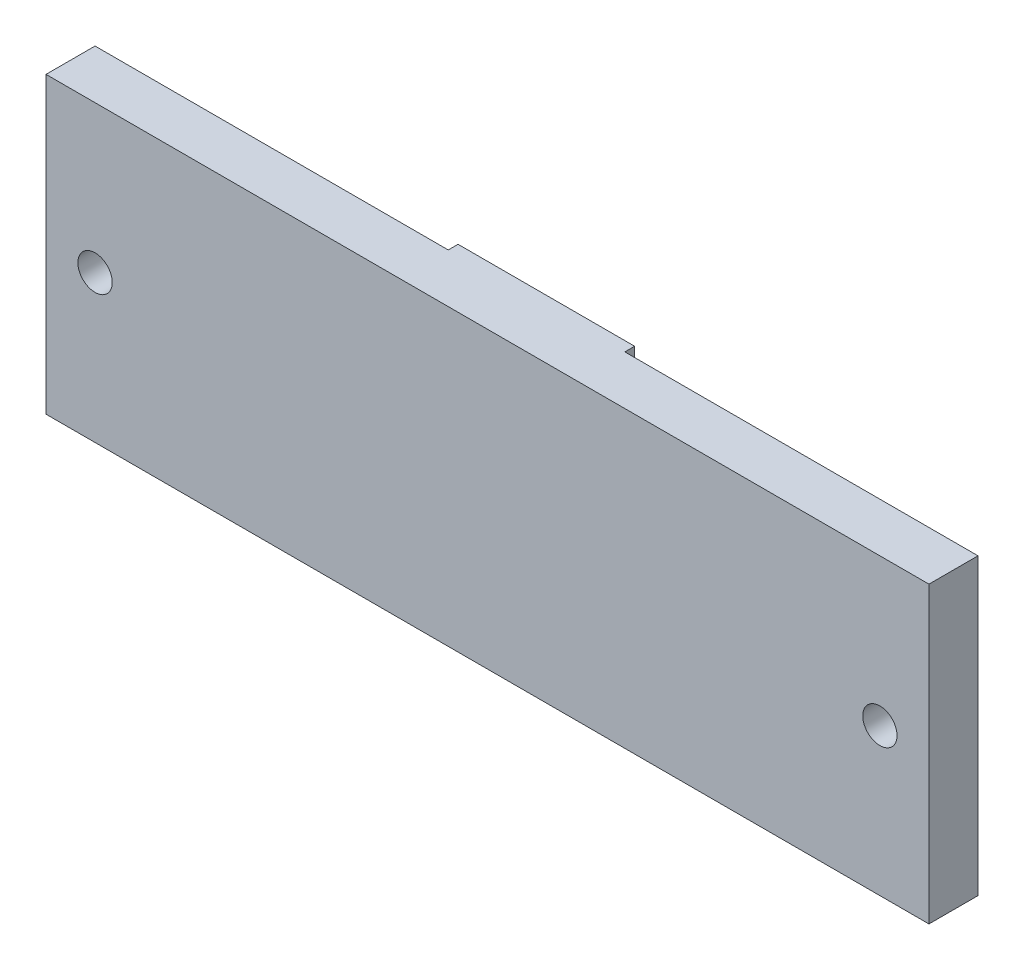
ISO-10303-21;
HEADER;
FILE_DESCRIPTION(('STEP AP214'),'2;1');
FILE_NAME('part.step','',(''),(''),'','','');
FILE_SCHEMA(('AUTOMOTIVE_DESIGN { 1 0 10303 214 1 1 1 1 }'));
ENDSEC;
DATA;
#1=APPLICATION_CONTEXT('core data for automotive mechanical design processes');
#2=APPLICATION_PROTOCOL_DEFINITION('international standard','automotive_design',2000,#1);
#3=PRODUCT_CONTEXT('',#1,'mechanical');
#4=PRODUCT('Part','Part','',(#3));
#5=PRODUCT_RELATED_PRODUCT_CATEGORY('part','',(#4));
#6=PRODUCT_DEFINITION_FORMATION('','',#4);
#7=PRODUCT_DEFINITION_CONTEXT('part definition',#1,'design');
#8=PRODUCT_DEFINITION('design','',#6,#7);
#9=PRODUCT_DEFINITION_SHAPE('','',#8);
#10=(LENGTH_UNIT() NAMED_UNIT(*) SI_UNIT(.MILLI.,.METRE.));
#11=(NAMED_UNIT(*) PLANE_ANGLE_UNIT() SI_UNIT($,.RADIAN.));
#12=(NAMED_UNIT(*) SI_UNIT($,.STERADIAN.) SOLID_ANGLE_UNIT());
#13=UNCERTAINTY_MEASURE_WITH_UNIT(LENGTH_MEASURE(1.E-05),#10,'distance_accuracy_value','');
#14=(GEOMETRIC_REPRESENTATION_CONTEXT(3) GLOBAL_UNCERTAINTY_ASSIGNED_CONTEXT((#13)) GLOBAL_UNIT_ASSIGNED_CONTEXT((#10,
#11,#12)) REPRESENTATION_CONTEXT('',''));
#15=CARTESIAN_POINT('',(0.,0.,0.));
#16=DIRECTION('',(0.,0.,1.));
#17=DIRECTION('',(1.,0.,0.));
#18=AXIS2_PLACEMENT_3D('',#15,#16,#17);
#19=CARTESIAN_POINT('',(0.,0.,0.));
#20=DIRECTION('',(0.,0.,-1.));
#21=DIRECTION('',(-1.,0.,0.));
#22=AXIS2_PLACEMENT_3D('',#19,#20,#21);
#23=PLANE('',#22);
#24=DIRECTION('',(0.,-1.,0.));
#25=VECTOR('',#24,1.);
#26=CARTESIAN_POINT('',(9.,0.,0.));
#27=LINE('',#26,#25);
#28=CARTESIAN_POINT('',(9.00000000000001,0.,0.));
#29=VERTEX_POINT('',#28);
#30=CARTESIAN_POINT('',(9.00000000000001,-30.,0.));
#31=VERTEX_POINT('',#30);
#32=EDGE_CURVE('E48',#29,#31,#27,.T.);
#33=ORIENTED_EDGE('',*,*,#32,.F.);
#34=DIRECTION('',(-1.,0.,0.));
#35=VECTOR('',#34,1.);
#36=CARTESIAN_POINT('',(45.,0.,0.));
#37=LINE('',#36,#35);
#38=CARTESIAN_POINT('',(45.,0.,0.));
#39=VERTEX_POINT('',#38);
#40=EDGE_CURVE('E151',#39,#29,#37,.T.);
#41=ORIENTED_EDGE('',*,*,#40,.F.);
#42=DIRECTION('',(0.,1.,0.));
#43=VECTOR('',#42,1.);
#44=CARTESIAN_POINT('',(45.,0.,0.));
#45=LINE('',#44,#43);
#46=CARTESIAN_POINT('',(45.,-30.,0.));
#47=VERTEX_POINT('',#46);
#48=EDGE_CURVE('E131',#47,#39,#45,.T.);
#49=ORIENTED_EDGE('',*,*,#48,.F.);
#50=DIRECTION('',(1.,0.,0.));
#51=VECTOR('',#50,1.);
#52=CARTESIAN_POINT('',(45.,-30.,0.));
#53=LINE('',#52,#51);
#54=EDGE_CURVE('E53',#31,#47,#53,.T.);
#55=ORIENTED_EDGE('',*,*,#54,.F.);
#56=EDGE_LOOP('',(#33,#41,#49,#55));
#57=FACE_BOUND('',#56,.T.);
#58=CARTESIAN_POINT('',(40.,-15.,0.));
#59=DIRECTION('',(0.,0.,1.));
#60=DIRECTION('',(1.,0.,0.));
#61=AXIS2_PLACEMENT_3D('',#58,#59,#60);
#62=CIRCLE('',#61,1.75);
#63=CARTESIAN_POINT('',(41.75,-15.,0.));
#64=VERTEX_POINT('',#63);
#65=EDGE_CURVE('E128',#64,#64,#62,.T.);
#66=ORIENTED_EDGE('',*,*,#65,.T.);
#67=EDGE_LOOP('',(#66));
#68=FACE_BOUND('',#67,.T.);
#69=ADVANCED_FACE('F33',(#57,#68),#23,.T.);
#70=CARTESIAN_POINT('',(45.,0.,5.));
#71=DIRECTION('',(-1.,0.,0.));
#72=DIRECTION('',(0.,0.,1.));
#73=AXIS2_PLACEMENT_3D('',#70,#71,#72);
#74=PLANE('',#73);
#75=ORIENTED_EDGE('',*,*,#48,.T.);
#76=DIRECTION('',(0.,0.,-1.));
#77=VECTOR('',#76,1.);
#78=CARTESIAN_POINT('',(45.,0.,5.));
#79=LINE('',#78,#77);
#80=CARTESIAN_POINT('',(45.,0.,5.));
#81=VERTEX_POINT('',#80);
#82=EDGE_CURVE('E11',#81,#39,#79,.T.);
#83=ORIENTED_EDGE('',*,*,#82,.F.);
#84=DIRECTION('',(0.,1.,0.));
#85=VECTOR('',#84,1.);
#86=CARTESIAN_POINT('',(45.,0.,5.));
#87=LINE('',#86,#85);
#88=CARTESIAN_POINT('',(45.,-30.,5.));
#89=VERTEX_POINT('',#88);
#90=EDGE_CURVE('E137',#89,#81,#87,.T.);
#91=ORIENTED_EDGE('',*,*,#90,.F.);
#92=DIRECTION('',(0.,0.,-1.));
#93=VECTOR('',#92,1.);
#94=CARTESIAN_POINT('',(45.,-30.,5.));
#95=LINE('',#94,#93);
#96=EDGE_CURVE('E147',#89,#47,#95,.T.);
#97=ORIENTED_EDGE('',*,*,#96,.T.);
#98=EDGE_LOOP('',(#75,#83,#91,#97));
#99=FACE_BOUND('',#98,.T.);
#100=ADVANCED_FACE('F35',(#99),#74,.F.);
#101=CARTESIAN_POINT('',(45.,0.,5.));
#102=DIRECTION('',(0.,-1.,0.));
#103=DIRECTION('',(0.,0.,-1.));
#104=AXIS2_PLACEMENT_3D('',#101,#102,#103);
#105=PLANE('',#104);
#106=ORIENTED_EDGE('',*,*,#40,.T.);
#107=DIRECTION('',(0.,0.,1.));
#108=VECTOR('',#107,1.);
#109=CARTESIAN_POINT('',(9.,0.,-1.));
#110=LINE('',#109,#108);
#111=CARTESIAN_POINT('',(9.,0.,-1.));
#112=VERTEX_POINT('',#111);
#113=EDGE_CURVE('E179',#112,#29,#110,.T.);
#114=ORIENTED_EDGE('',*,*,#113,.F.);
#115=DIRECTION('',(1.,0.,0.));
#116=VECTOR('',#115,1.);
#117=CARTESIAN_POINT('',(9.,0.,-1.));
#118=LINE('',#117,#116);
#119=CARTESIAN_POINT('',(-9.,0.,-1.));
#120=VERTEX_POINT('',#119);
#121=EDGE_CURVE('E112',#120,#112,#118,.T.);
#122=ORIENTED_EDGE('',*,*,#121,.F.);
#123=DIRECTION('',(0.,0.,1.));
#124=VECTOR('',#123,1.);
#125=CARTESIAN_POINT('',(-9.,0.,-1.));
#126=LINE('',#125,#124);
#127=CARTESIAN_POINT('',(-9.,0.,0.));
#128=VERTEX_POINT('',#127);
#129=EDGE_CURVE('E124',#120,#128,#126,.T.);
#130=ORIENTED_EDGE('',*,*,#129,.T.);
#131=CARTESIAN_POINT('',(-45.,0.,0.));
#132=VERTEX_POINT('',#131);
#133=EDGE_CURVE('E150',#128,#132,#37,.T.);
#134=ORIENTED_EDGE('',*,*,#133,.T.);
#135=DIRECTION('',(0.,0.,-1.));
#136=VECTOR('',#135,1.);
#137=CARTESIAN_POINT('',(-45.,0.,5.));
#138=LINE('',#137,#136);
#139=CARTESIAN_POINT('',(-45.,0.,5.));
#140=VERTEX_POINT('',#139);
#141=EDGE_CURVE('E41',#140,#132,#138,.T.);
#142=ORIENTED_EDGE('',*,*,#141,.F.);
#143=DIRECTION('',(-1.,0.,0.));
#144=VECTOR('',#143,1.);
#145=CARTESIAN_POINT('',(45.,0.,5.));
#146=LINE('',#145,#144);
#147=EDGE_CURVE('E140',#81,#140,#146,.T.);
#148=ORIENTED_EDGE('',*,*,#147,.F.);
#149=ORIENTED_EDGE('',*,*,#82,.T.);
#150=EDGE_LOOP('',(#106,#114,#122,#130,#134,#142,#148,#149));
#151=FACE_BOUND('',#150,.T.);
#152=ADVANCED_FACE('F184',(#151),#105,.F.);
#153=CARTESIAN_POINT('',(-45.,0.,5.));
#154=DIRECTION('',(1.,0.,0.));
#155=DIRECTION('',(0.,0.,-1.));
#156=AXIS2_PLACEMENT_3D('',#153,#154,#155);
#157=PLANE('',#156);
#158=DIRECTION('',(0.,-1.,0.));
#159=VECTOR('',#158,1.);
#160=CARTESIAN_POINT('',(-45.,0.,0.));
#161=LINE('',#160,#159);
#162=CARTESIAN_POINT('',(-45.,-30.,0.));
#163=VERTEX_POINT('',#162);
#164=EDGE_CURVE('E153',#132,#163,#161,.T.);
#165=ORIENTED_EDGE('',*,*,#164,.T.);
#166=DIRECTION('',(0.,0.,-1.));
#167=VECTOR('',#166,1.);
#168=CARTESIAN_POINT('',(-45.,-30.,5.));
#169=LINE('',#168,#167);
#170=CARTESIAN_POINT('',(-45.,-30.,5.));
#171=VERTEX_POINT('',#170);
#172=EDGE_CURVE('E158',#171,#163,#169,.T.);
#173=ORIENTED_EDGE('',*,*,#172,.F.);
#174=DIRECTION('',(0.,-1.,0.));
#175=VECTOR('',#174,1.);
#176=CARTESIAN_POINT('',(-45.,0.,5.));
#177=LINE('',#176,#175);
#178=EDGE_CURVE('E143',#140,#171,#177,.T.);
#179=ORIENTED_EDGE('',*,*,#178,.F.);
#180=ORIENTED_EDGE('',*,*,#141,.T.);
#181=EDGE_LOOP('',(#165,#173,#179,#180));
#182=FACE_BOUND('',#181,.T.);
#183=ADVANCED_FACE('F165',(#182),#157,.F.);
#184=CARTESIAN_POINT('',(45.,-30.,5.));
#185=DIRECTION('',(0.,1.,0.));
#186=DIRECTION('',(0.,0.,1.));
#187=AXIS2_PLACEMENT_3D('',#184,#185,#186);
#188=PLANE('',#187);
#189=CARTESIAN_POINT('',(-8.99999999999999,-30.,0.));
#190=VERTEX_POINT('',#189);
#191=EDGE_CURVE('E141',#163,#190,#53,.T.);
#192=ORIENTED_EDGE('',*,*,#191,.T.);
#193=DIRECTION('',(0.,0.,1.));
#194=VECTOR('',#193,1.);
#195=CARTESIAN_POINT('',(-9.00000000000001,-30.,-1.));
#196=LINE('',#195,#194);
#197=CARTESIAN_POINT('',(-9.00000000000001,-30.,-1.));
#198=VERTEX_POINT('',#197);
#199=EDGE_CURVE('E103',#198,#190,#196,.T.);
#200=ORIENTED_EDGE('',*,*,#199,.F.);
#201=DIRECTION('',(-1.,0.,0.));
#202=VECTOR('',#201,1.);
#203=CARTESIAN_POINT('',(9.,-30.,-1.));
#204=LINE('',#203,#202);
#205=CARTESIAN_POINT('',(9.,-30.,-1.));
#206=VERTEX_POINT('',#205);
#207=EDGE_CURVE('E96',#206,#198,#204,.T.);
#208=ORIENTED_EDGE('',*,*,#207,.F.);
#209=DIRECTION('',(0.,0.,1.));
#210=VECTOR('',#209,1.);
#211=CARTESIAN_POINT('',(9.,-30.,-1.));
#212=LINE('',#211,#210);
#213=EDGE_CURVE('E101',#206,#31,#212,.T.);
#214=ORIENTED_EDGE('',*,*,#213,.T.);
#215=ORIENTED_EDGE('',*,*,#54,.T.);
#216=ORIENTED_EDGE('',*,*,#96,.F.);
#217=DIRECTION('',(1.,0.,0.));
#218=VECTOR('',#217,1.);
#219=CARTESIAN_POINT('',(45.,-30.,5.));
#220=LINE('',#219,#218);
#221=EDGE_CURVE('E145',#171,#89,#220,.T.);
#222=ORIENTED_EDGE('',*,*,#221,.F.);
#223=ORIENTED_EDGE('',*,*,#172,.T.);
#224=EDGE_LOOP('',(#192,#200,#208,#214,#215,#216,#222,#223));
#225=FACE_BOUND('',#224,.T.);
#226=ADVANCED_FACE('F99',(#225),#188,.F.);
#227=CARTESIAN_POINT('',(0.,0.,5.));
#228=DIRECTION('',(0.,0.,-1.));
#229=DIRECTION('',(-1.,0.,0.));
#230=AXIS2_PLACEMENT_3D('',#227,#228,#229);
#231=PLANE('',#230);
#232=CARTESIAN_POINT('',(40.,-15.,5.));
#233=DIRECTION('',(0.,0.,1.));
#234=DIRECTION('',(1.,0.,0.));
#235=AXIS2_PLACEMENT_3D('',#232,#233,#234);
#236=CIRCLE('',#235,1.75);
#237=CARTESIAN_POINT('',(41.75,-15.,5.));
#238=VERTEX_POINT('',#237);
#239=EDGE_CURVE('E132',#238,#238,#236,.T.);
#240=ORIENTED_EDGE('',*,*,#239,.F.);
#241=EDGE_LOOP('',(#240));
#242=FACE_BOUND('',#241,.T.);
#243=CARTESIAN_POINT('',(-40.,-15.,5.));
#244=DIRECTION('',(0.,0.,1.));
#245=DIRECTION('',(1.,0.,0.));
#246=AXIS2_PLACEMENT_3D('',#243,#244,#245);
#247=CIRCLE('',#246,1.75);
#248=CARTESIAN_POINT('',(-38.25,-15.,5.));
#249=VERTEX_POINT('',#248);
#250=EDGE_CURVE('E119',#249,#249,#247,.T.);
#251=ORIENTED_EDGE('',*,*,#250,.F.);
#252=EDGE_LOOP('',(#251));
#253=FACE_BOUND('',#252,.T.);
#254=ORIENTED_EDGE('',*,*,#90,.T.);
#255=ORIENTED_EDGE('',*,*,#147,.T.);
#256=ORIENTED_EDGE('',*,*,#178,.T.);
#257=ORIENTED_EDGE('',*,*,#221,.T.);
#258=EDGE_LOOP('',(#254,#255,#256,#257));
#259=FACE_BOUND('',#258,.T.);
#260=ADVANCED_FACE('F191',(#242,#253,#259),#231,.F.);
#261=DIRECTION('',(0.,1.,0.));
#262=VECTOR('',#261,1.);
#263=CARTESIAN_POINT('',(-9.,0.,0.));
#264=LINE('',#263,#262);
#265=EDGE_CURVE('E116',#190,#128,#264,.T.);
#266=ORIENTED_EDGE('',*,*,#265,.F.);
#267=ORIENTED_EDGE('',*,*,#191,.F.);
#268=ORIENTED_EDGE('',*,*,#164,.F.);
#269=ORIENTED_EDGE('',*,*,#133,.F.);
#270=EDGE_LOOP('',(#266,#267,#268,#269));
#271=FACE_BOUND('',#270,.T.);
#272=CARTESIAN_POINT('',(-40.,-15.,0.));
#273=DIRECTION('',(0.,0.,1.));
#274=DIRECTION('',(1.,0.,0.));
#275=AXIS2_PLACEMENT_3D('',#272,#273,#274);
#276=CIRCLE('',#275,1.75);
#277=CARTESIAN_POINT('',(-38.25,-15.,0.));
#278=VERTEX_POINT('',#277);
#279=EDGE_CURVE('E122',#278,#278,#276,.T.);
#280=ORIENTED_EDGE('',*,*,#279,.T.);
#281=EDGE_LOOP('',(#280));
#282=FACE_BOUND('',#281,.T.);
#283=ADVANCED_FACE('F170',(#271,#282),#23,.T.);
#284=CARTESIAN_POINT('',(-40.,-15.,0.));
#285=DIRECTION('',(0.,0.,1.));
#286=DIRECTION('',(1.,0.,0.));
#287=AXIS2_PLACEMENT_3D('',#284,#285,#286);
#288=CYLINDRICAL_SURFACE('',#287,1.75);
#289=ORIENTED_EDGE('',*,*,#279,.F.);
#290=EDGE_LOOP('',(#289));
#291=FACE_BOUND('',#290,.T.);
#292=ORIENTED_EDGE('',*,*,#250,.T.);
#293=EDGE_LOOP('',(#292));
#294=FACE_BOUND('',#293,.T.);
#295=ADVANCED_FACE('F199',(#291,#294),#288,.F.);
#296=CARTESIAN_POINT('',(40.,-15.,0.));
#297=DIRECTION('',(0.,0.,1.));
#298=DIRECTION('',(1.,0.,0.));
#299=AXIS2_PLACEMENT_3D('',#296,#297,#298);
#300=CYLINDRICAL_SURFACE('',#299,1.75);
#301=ORIENTED_EDGE('',*,*,#65,.F.);
#302=EDGE_LOOP('',(#301));
#303=FACE_BOUND('',#302,.T.);
#304=ORIENTED_EDGE('',*,*,#239,.T.);
#305=EDGE_LOOP('',(#304));
#306=FACE_BOUND('',#305,.T.);
#307=ADVANCED_FACE('F243',(#303,#306),#300,.F.);
#308=CARTESIAN_POINT('',(9.,0.,-1.));
#309=DIRECTION('',(-1.,0.,0.));
#310=DIRECTION('',(0.,-1.,0.));
#311=AXIS2_PLACEMENT_3D('',#308,#309,#310);
#312=PLANE('',#311);
#313=ORIENTED_EDGE('',*,*,#32,.T.);
#314=ORIENTED_EDGE('',*,*,#213,.F.);
#315=DIRECTION('',(0.,-1.,0.));
#316=VECTOR('',#315,1.);
#317=CARTESIAN_POINT('',(9.,0.,-1.));
#318=LINE('',#317,#316);
#319=EDGE_CURVE('E107',#112,#206,#318,.T.);
#320=ORIENTED_EDGE('',*,*,#319,.F.);
#321=ORIENTED_EDGE('',*,*,#113,.T.);
#322=EDGE_LOOP('',(#313,#314,#320,#321));
#323=FACE_BOUND('',#322,.T.);
#324=ADVANCED_FACE('F118',(#323),#312,.F.);
#325=CARTESIAN_POINT('',(-9.,0.,-1.));
#326=DIRECTION('',(1.,0.,0.));
#327=DIRECTION('',(0.,1.,0.));
#328=AXIS2_PLACEMENT_3D('',#325,#326,#327);
#329=PLANE('',#328);
#330=ORIENTED_EDGE('',*,*,#265,.T.);
#331=ORIENTED_EDGE('',*,*,#129,.F.);
#332=DIRECTION('',(0.,1.,0.));
#333=VECTOR('',#332,1.);
#334=CARTESIAN_POINT('',(-9.,0.,-1.));
#335=LINE('',#334,#333);
#336=EDGE_CURVE('E106',#198,#120,#335,.T.);
#337=ORIENTED_EDGE('',*,*,#336,.F.);
#338=ORIENTED_EDGE('',*,*,#199,.T.);
#339=EDGE_LOOP('',(#330,#331,#337,#338));
#340=FACE_BOUND('',#339,.T.);
#341=ADVANCED_FACE('F175',(#340),#329,.F.);
#342=CARTESIAN_POINT('',(0.,0.,-1.));
#343=DIRECTION('',(0.,0.,-1.));
#344=DIRECTION('',(-1.,0.,0.));
#345=AXIS2_PLACEMENT_3D('',#342,#343,#344);
#346=PLANE('',#345);
#347=ORIENTED_EDGE('',*,*,#319,.T.);
#348=ORIENTED_EDGE('',*,*,#207,.T.);
#349=ORIENTED_EDGE('',*,*,#336,.T.);
#350=ORIENTED_EDGE('',*,*,#121,.T.);
#351=EDGE_LOOP('',(#347,#348,#349,#350));
#352=FACE_BOUND('',#351,.T.);
#353=ADVANCED_FACE('F110',(#352),#346,.T.);
#354=CLOSED_SHELL('',(#69,#100,#152,#183,#226,#260,#283,#295,#307,#324,#341,#353));
#355=MANIFOLD_SOLID_BREP('B2',#354);
#356=ADVANCED_BREP_SHAPE_REPRESENTATION('',(#18,#355),#14);
#357=SHAPE_DEFINITION_REPRESENTATION(#9,#356);
ENDSEC;
END-ISO-10303-21;
